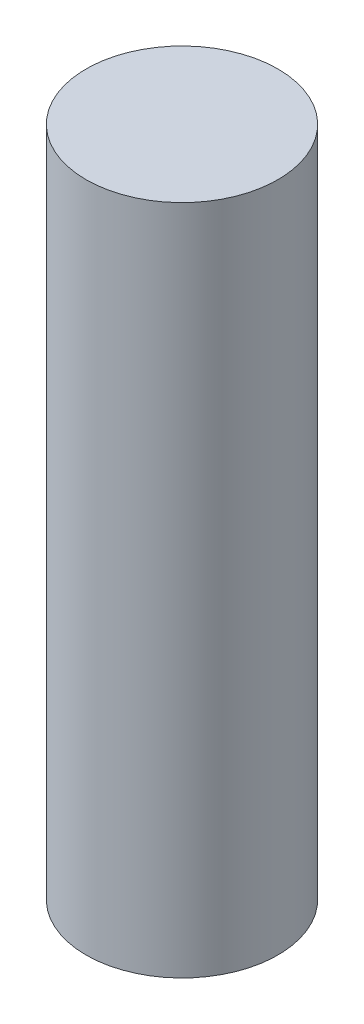
ISO-10303-21;
HEADER;
FILE_DESCRIPTION(('STEP AP214'),'2;1');
FILE_NAME('part.step','',(''),(''),'','','');
FILE_SCHEMA(('AUTOMOTIVE_DESIGN { 1 0 10303 214 1 1 1 1 }'));
ENDSEC;
DATA;
#1=APPLICATION_CONTEXT('core data for automotive mechanical design processes');
#2=APPLICATION_PROTOCOL_DEFINITION('international standard','automotive_design',2000,#1);
#3=PRODUCT_CONTEXT('',#1,'mechanical');
#4=PRODUCT('Part','Part','',(#3));
#5=PRODUCT_RELATED_PRODUCT_CATEGORY('part','',(#4));
#6=PRODUCT_DEFINITION_FORMATION('','',#4);
#7=PRODUCT_DEFINITION_CONTEXT('part definition',#1,'design');
#8=PRODUCT_DEFINITION('design','',#6,#7);
#9=PRODUCT_DEFINITION_SHAPE('','',#8);
#10=(LENGTH_UNIT() NAMED_UNIT(*) SI_UNIT(.MILLI.,.METRE.));
#11=(NAMED_UNIT(*) PLANE_ANGLE_UNIT() SI_UNIT($,.RADIAN.));
#12=(NAMED_UNIT(*) SI_UNIT($,.STERADIAN.) SOLID_ANGLE_UNIT());
#13=UNCERTAINTY_MEASURE_WITH_UNIT(LENGTH_MEASURE(1.E-05),#10,'distance_accuracy_value','');
#14=(GEOMETRIC_REPRESENTATION_CONTEXT(3) GLOBAL_UNCERTAINTY_ASSIGNED_CONTEXT((#13)) GLOBAL_UNIT_ASSIGNED_CONTEXT((#10,
#11,#12)) REPRESENTATION_CONTEXT('',''));
#15=CARTESIAN_POINT('',(0.,0.,0.));
#16=DIRECTION('',(0.,0.,1.));
#17=DIRECTION('',(1.,0.,0.));
#18=AXIS2_PLACEMENT_3D('',#15,#16,#17);
#19=CARTESIAN_POINT('',(0.,7.,0.));
#20=DIRECTION('',(0.,-1.,0.));
#21=DIRECTION('',(0.,0.,-1.));
#22=AXIS2_PLACEMENT_3D('',#19,#20,#21);
#23=CYLINDRICAL_SURFACE('',#22,2.);
#24=CARTESIAN_POINT('',(0.,7.,0.));
#25=DIRECTION('',(0.,1.,0.));
#26=DIRECTION('',(0.,0.,1.));
#27=AXIS2_PLACEMENT_3D('',#24,#25,#26);
#28=CIRCLE('',#27,2.);
#29=CARTESIAN_POINT('',(0.,7.,2.));
#30=VERTEX_POINT('',#29);
#31=EDGE_CURVE('E10',#30,#30,#28,.T.);
#32=ORIENTED_EDGE('',*,*,#31,.F.);
#33=EDGE_LOOP('',(#32));
#34=FACE_BOUND('',#33,.T.);
#35=CARTESIAN_POINT('',(0.,-7.,0.));
#36=DIRECTION('',(0.,1.,0.));
#37=DIRECTION('',(0.,0.,1.));
#38=AXIS2_PLACEMENT_3D('',#35,#36,#37);
#39=CIRCLE('',#38,2.);
#40=CARTESIAN_POINT('',(0.,-7.,2.));
#41=VERTEX_POINT('',#40);
#42=EDGE_CURVE('E33',#41,#41,#39,.T.);
#43=ORIENTED_EDGE('',*,*,#42,.T.);
#44=EDGE_LOOP('',(#43));
#45=FACE_BOUND('',#44,.T.);
#46=ADVANCED_FACE('F30',(#34,#45),#23,.T.);
#47=CARTESIAN_POINT('',(0.,7.,0.));
#48=DIRECTION('',(0.,1.,0.));
#49=DIRECTION('',(0.,0.,1.));
#50=AXIS2_PLACEMENT_3D('',#47,#48,#49);
#51=PLANE('',#50);
#52=ORIENTED_EDGE('',*,*,#31,.T.);
#53=EDGE_LOOP('',(#52));
#54=FACE_BOUND('',#53,.T.);
#55=ADVANCED_FACE('F45',(#54),#51,.T.);
#56=CARTESIAN_POINT('',(0.,-7.,0.));
#57=DIRECTION('',(0.,1.,0.));
#58=DIRECTION('',(0.,0.,1.));
#59=AXIS2_PLACEMENT_3D('',#56,#57,#58);
#60=PLANE('',#59);
#61=ORIENTED_EDGE('',*,*,#42,.F.);
#62=EDGE_LOOP('',(#61));
#63=FACE_BOUND('',#62,.T.);
#64=ADVANCED_FACE('F43',(#63),#60,.F.);
#65=CLOSED_SHELL('',(#46,#55,#64));
#66=MANIFOLD_SOLID_BREP('B2',#65);
#67=ADVANCED_BREP_SHAPE_REPRESENTATION('',(#18,#66),#14);
#68=SHAPE_DEFINITION_REPRESENTATION(#9,#67);
ENDSEC;
END-ISO-10303-21;
